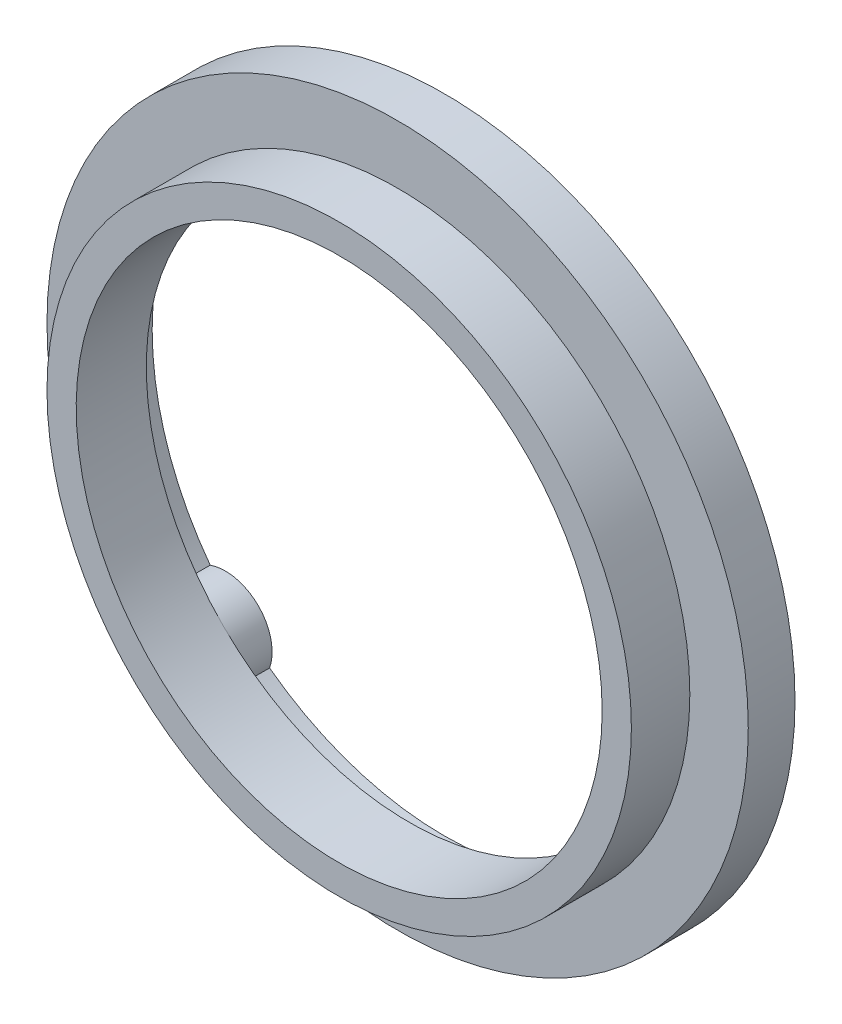
ISO-10303-21;
HEADER;
FILE_DESCRIPTION(('STEP AP214'),'2;1');
FILE_NAME('part.step','',(''),(''),'','','');
FILE_SCHEMA(('AUTOMOTIVE_DESIGN { 1 0 10303 214 1 1 1 1 }'));
ENDSEC;
DATA;
#1=APPLICATION_CONTEXT('core data for automotive mechanical design processes');
#2=APPLICATION_PROTOCOL_DEFINITION('international standard','automotive_design',2000,#1);
#3=PRODUCT_CONTEXT('',#1,'mechanical');
#4=PRODUCT('Part','Part','',(#3));
#5=PRODUCT_RELATED_PRODUCT_CATEGORY('part','',(#4));
#6=PRODUCT_DEFINITION_FORMATION('','',#4);
#7=PRODUCT_DEFINITION_CONTEXT('part definition',#1,'design');
#8=PRODUCT_DEFINITION('design','',#6,#7);
#9=PRODUCT_DEFINITION_SHAPE('','',#8);
#10=(LENGTH_UNIT() NAMED_UNIT(*) SI_UNIT(.MILLI.,.METRE.));
#11=(NAMED_UNIT(*) PLANE_ANGLE_UNIT() SI_UNIT($,.RADIAN.));
#12=(NAMED_UNIT(*) SI_UNIT($,.STERADIAN.) SOLID_ANGLE_UNIT());
#13=UNCERTAINTY_MEASURE_WITH_UNIT(LENGTH_MEASURE(1.E-05),#10,'distance_accuracy_value','');
#14=(GEOMETRIC_REPRESENTATION_CONTEXT(3) GLOBAL_UNCERTAINTY_ASSIGNED_CONTEXT((#13)) GLOBAL_UNIT_ASSIGNED_CONTEXT((#10,
#11,#12)) REPRESENTATION_CONTEXT('',''));
#15=CARTESIAN_POINT('',(0.,0.,0.));
#16=DIRECTION('',(0.,0.,1.));
#17=DIRECTION('',(1.,0.,0.));
#18=AXIS2_PLACEMENT_3D('',#15,#16,#17);
#19=CARTESIAN_POINT('',(-86.6066497970745,-63.7835303855215,4.));
#20=DIRECTION('',(0.,0.,1.));
#21=DIRECTION('',(1.,0.,0.));
#22=AXIS2_PLACEMENT_3D('',#19,#20,#21);
#23=PLANE('',#22);
#24=CARTESIAN_POINT('',(-86.6066497970745,-63.7835303855215,4.));
#25=DIRECTION('',(0.,0.,1.));
#26=DIRECTION('',(1.,0.,0.));
#27=AXIS2_PLACEMENT_3D('',#24,#25,#26);
#28=CIRCLE('',#27,30.);
#29=CARTESIAN_POINT('',(-56.6066497970745,-63.7835303855215,4.));
#30=VERTEX_POINT('',#29);
#31=EDGE_CURVE('E149',#30,#30,#28,.T.);
#32=ORIENTED_EDGE('',*,*,#31,.T.);
#33=EDGE_LOOP('',(#32));
#34=FACE_BOUND('',#33,.T.);
#35=CARTESIAN_POINT('',(-86.6066497970745,-63.7835303855215,4.));
#36=DIRECTION('',(0.,0.,1.));
#37=DIRECTION('',(1.,0.,0.));
#38=AXIS2_PLACEMENT_3D('',#35,#36,#37);
#39=CIRCLE('',#38,25.0000000000019);
#40=CARTESIAN_POINT('',(-61.6066497970727,-63.7835303855215,4.));
#41=VERTEX_POINT('',#40);
#42=EDGE_CURVE('E211',#41,#41,#39,.T.);
#43=ORIENTED_EDGE('',*,*,#42,.F.);
#44=EDGE_LOOP('',(#43));
#45=FACE_BOUND('',#44,.T.);
#46=ADVANCED_FACE('F41',(#34,#45),#23,.T.);
#47=CARTESIAN_POINT('',(-86.6066497970745,-63.7835303855215,0.));
#48=DIRECTION('',(0.,0.,1.));
#49=DIRECTION('',(1.,0.,0.));
#50=AXIS2_PLACEMENT_3D('',#47,#48,#49);
#51=PLANE('',#50);
#52=CARTESIAN_POINT('',(-86.6066497970745,-63.7835303855215,0.));
#53=DIRECTION('',(0.,0.,1.));
#54=DIRECTION('',(1.,0.,0.));
#55=AXIS2_PLACEMENT_3D('',#52,#53,#54);
#56=CIRCLE('',#55,30.);
#57=CARTESIAN_POINT('',(-56.6066497970745,-63.7835303855215,0.));
#58=VERTEX_POINT('',#57);
#59=EDGE_CURVE('E11',#58,#58,#56,.T.);
#60=ORIENTED_EDGE('',*,*,#59,.F.);
#61=EDGE_LOOP('',(#60));
#62=FACE_BOUND('',#61,.T.);
#63=CARTESIAN_POINT('',(-86.6066497970745,-63.7835303855215,0.));
#64=DIRECTION('',(0.,0.,1.));
#65=DIRECTION('',(1.,0.,0.));
#66=AXIS2_PLACEMENT_3D('',#63,#64,#65);
#67=CIRCLE('',#66,25.);
#68=CARTESIAN_POINT('',(-106.64098914591,-48.8294257030042,0.));
#69=VERTEX_POINT('',#68);
#70=CARTESIAN_POINT('',(-106.64098914591,-78.7376350680388,0.));
#71=VERTEX_POINT('',#70);
#72=EDGE_CURVE('E56',#69,#71,#67,.T.);
#73=ORIENTED_EDGE('',*,*,#72,.T.);
#74=CARTESIAN_POINT('',(-105.344979498517,-82.5218600869651,0.));
#75=DIRECTION('',(0.,0.,-1.));
#76=DIRECTION('',(1.,0.,0.));
#77=AXIS2_PLACEMENT_3D('',#74,#75,#76);
#78=CIRCLE('',#77,4.00000000000055);
#79=CARTESIAN_POINT('',(-101.560754479591,-83.8178697343583,0.));
#80=VERTEX_POINT('',#79);
#81=EDGE_CURVE('E148',#71,#80,#78,.T.);
#82=ORIENTED_EDGE('',*,*,#81,.T.);
#83=CARTESIAN_POINT('',(-86.6066497970745,-63.7835303855215,0.));
#84=DIRECTION('',(0.,0.,1.));
#85=DIRECTION('',(1.,0.,0.));
#86=AXIS2_PLACEMENT_3D('',#83,#84,#85);
#87=CIRCLE('',#86,25.);
#88=CARTESIAN_POINT('',(-71.6525451145571,-83.8178697343573,0.));
#89=VERTEX_POINT('',#88);
#90=EDGE_CURVE('E151',#80,#89,#87,.T.);
#91=ORIENTED_EDGE('',*,*,#90,.T.);
#92=CARTESIAN_POINT('',(-67.8683200956299,-82.5218600869638,0.));
#93=DIRECTION('',(0.,0.,-1.));
#94=DIRECTION('',(1.,0.,0.));
#95=AXIS2_PLACEMENT_3D('',#92,#93,#94);
#96=CIRCLE('',#95,4.00000000000147);
#97=CARTESIAN_POINT('',(-66.5723104482369,-78.7376350680364,0.));
#98=VERTEX_POINT('',#97);
#99=EDGE_CURVE('E123',#89,#98,#96,.T.);
#100=ORIENTED_EDGE('',*,*,#99,.T.);
#101=CARTESIAN_POINT('',(-86.6066497970745,-63.7835303855215,0.));
#102=DIRECTION('',(0.,0.,1.));
#103=DIRECTION('',(1.,0.,0.));
#104=AXIS2_PLACEMENT_3D('',#101,#102,#103);
#105=CIRCLE('',#104,25.);
#106=CARTESIAN_POINT('',(-66.5723104482388,-48.829425703004,0.));
#107=VERTEX_POINT('',#106);
#108=EDGE_CURVE('E121',#98,#107,#105,.T.);
#109=ORIENTED_EDGE('',*,*,#108,.T.);
#110=CARTESIAN_POINT('',(-67.8683200956311,-45.0452006840768,0.));
#111=DIRECTION('',(0.,0.,-1.));
#112=DIRECTION('',(1.,0.,0.));
#113=AXIS2_PLACEMENT_3D('',#110,#111,#112);
#114=CIRCLE('',#113,4.00000000000109);
#115=CARTESIAN_POINT('',(-71.6525451145585,-43.7491910366847,0.));
#116=VERTEX_POINT('',#115);
#117=EDGE_CURVE('E98',#107,#116,#114,.T.);
#118=ORIENTED_EDGE('',*,*,#117,.T.);
#119=CARTESIAN_POINT('',(-86.6066497970745,-63.7835303855215,0.));
#120=DIRECTION('',(0.,0.,1.));
#121=DIRECTION('',(1.,0.,0.));
#122=AXIS2_PLACEMENT_3D('',#119,#120,#121);
#123=CIRCLE('',#122,25.);
#124=CARTESIAN_POINT('',(-101.560754479592,-43.7491910366858,0.));
#125=VERTEX_POINT('',#124);
#126=EDGE_CURVE('E110',#116,#125,#123,.T.);
#127=ORIENTED_EDGE('',*,*,#126,.T.);
#128=CARTESIAN_POINT('',(-105.344979498518,-45.0452006840781,0.));
#129=DIRECTION('',(0.,0.,-1.));
#130=DIRECTION('',(1.,0.,0.));
#131=AXIS2_PLACEMENT_3D('',#128,#129,#130);
#132=CIRCLE('',#131,4.);
#133=EDGE_CURVE('E116',#125,#69,#132,.T.);
#134=ORIENTED_EDGE('',*,*,#133,.T.);
#135=EDGE_LOOP('',(#73,#82,#91,#100,#109,#118,#127,#134));
#136=FACE_BOUND('',#135,.T.);
#137=ADVANCED_FACE('F118',(#62,#136),#51,.F.);
#138=CARTESIAN_POINT('',(-86.6066497970745,-63.7835303855215,3.));
#139=DIRECTION('',(0.,0.,-1.));
#140=DIRECTION('',(-1.,0.,0.));
#141=AXIS2_PLACEMENT_3D('',#138,#139,#140);
#142=CYLINDRICAL_SURFACE('',#141,30.);
#143=ORIENTED_EDGE('',*,*,#59,.T.);
#144=EDGE_LOOP('',(#143));
#145=FACE_BOUND('',#144,.T.);
#146=ORIENTED_EDGE('',*,*,#31,.F.);
#147=EDGE_LOOP('',(#146));
#148=FACE_BOUND('',#147,.T.);
#149=ADVANCED_FACE('F43',(#145,#148),#142,.T.);
#150=CARTESIAN_POINT('',(-86.6066497970745,-63.7835303855215,3.));
#151=DIRECTION('',(0.,0.,-1.));
#152=DIRECTION('',(-1.,0.,0.));
#153=AXIS2_PLACEMENT_3D('',#150,#151,#152);
#154=CYLINDRICAL_SURFACE('',#153,25.);
#155=ORIENTED_EDGE('',*,*,#72,.F.);
#156=DIRECTION('',(0.,0.,-1.));
#157=VECTOR('',#156,1.);
#158=CARTESIAN_POINT('',(-106.64098914591,-48.8294257030042,3.));
#159=LINE('',#158,#157);
#160=CARTESIAN_POINT('',(-106.64098914591,-48.8294257030042,3.));
#161=VERTEX_POINT('',#160);
#162=EDGE_CURVE('E129',#161,#69,#159,.T.);
#163=ORIENTED_EDGE('',*,*,#162,.F.);
#164=CARTESIAN_POINT('',(-86.6066497970745,-63.7835303855215,3.));
#165=DIRECTION('',(0.,0.,1.));
#166=DIRECTION('',(1.,0.,0.));
#167=AXIS2_PLACEMENT_3D('',#164,#165,#166);
#168=CIRCLE('',#167,25.);
#169=CARTESIAN_POINT('',(-106.64098914591,-78.7376350680388,3.));
#170=VERTEX_POINT('',#169);
#171=EDGE_CURVE('E128',#161,#170,#168,.T.);
#172=ORIENTED_EDGE('',*,*,#171,.T.);
#173=DIRECTION('',(0.,0.,-1.));
#174=VECTOR('',#173,1.);
#175=CARTESIAN_POINT('',(-106.64098914591,-78.7376350680388,3.));
#176=LINE('',#175,#174);
#177=EDGE_CURVE('E49',#170,#71,#176,.T.);
#178=ORIENTED_EDGE('',*,*,#177,.T.);
#179=EDGE_LOOP('',(#155,#163,#172,#178));
#180=FACE_BOUND('',#179,.T.);
#181=ADVANCED_FACE('F141',(#180),#154,.F.);
#182=CARTESIAN_POINT('',(-105.344979498517,-82.5218600869651,3.));
#183=DIRECTION('',(0.,0.,-1.));
#184=DIRECTION('',(-1.,0.,0.));
#185=AXIS2_PLACEMENT_3D('',#182,#183,#184);
#186=CYLINDRICAL_SURFACE('',#185,4.00000000000055);
#187=ORIENTED_EDGE('',*,*,#81,.F.);
#188=ORIENTED_EDGE('',*,*,#177,.F.);
#189=CARTESIAN_POINT('',(-105.344979498517,-82.5218600869651,3.));
#190=DIRECTION('',(0.,0.,-1.));
#191=DIRECTION('',(1.,0.,0.));
#192=AXIS2_PLACEMENT_3D('',#189,#190,#191);
#193=CIRCLE('',#192,4.00000000000055);
#194=CARTESIAN_POINT('',(-102.516552373771,-79.6934329622191,3.));
#195=VERTEX_POINT('',#194);
#196=EDGE_CURVE('E204',#170,#195,#193,.T.);
#197=ORIENTED_EDGE('',*,*,#196,.T.);
#198=CARTESIAN_POINT('',(-101.560754479591,-83.8178697343583,3.));
#199=VERTEX_POINT('',#198);
#200=EDGE_CURVE('E206',#195,#199,#193,.T.);
#201=ORIENTED_EDGE('',*,*,#200,.T.);
#202=DIRECTION('',(0.,0.,-1.));
#203=VECTOR('',#202,1.);
#204=CARTESIAN_POINT('',(-101.560754479591,-83.8178697343583,3.));
#205=LINE('',#204,#203);
#206=EDGE_CURVE('E138',#199,#80,#205,.T.);
#207=ORIENTED_EDGE('',*,*,#206,.T.);
#208=EDGE_LOOP('',(#187,#188,#197,#201,#207));
#209=FACE_BOUND('',#208,.T.);
#210=ADVANCED_FACE('F263',(#209),#186,.T.);
#211=CARTESIAN_POINT('',(-86.6066497970745,-63.7835303855215,3.));
#212=DIRECTION('',(0.,0.,-1.));
#213=DIRECTION('',(-1.,0.,0.));
#214=AXIS2_PLACEMENT_3D('',#211,#212,#213);
#215=CYLINDRICAL_SURFACE('',#214,25.);
#216=ORIENTED_EDGE('',*,*,#90,.F.);
#217=ORIENTED_EDGE('',*,*,#206,.F.);
#218=CARTESIAN_POINT('',(-86.6066497970745,-63.7835303855215,3.));
#219=DIRECTION('',(0.,0.,1.));
#220=DIRECTION('',(1.,0.,0.));
#221=AXIS2_PLACEMENT_3D('',#218,#219,#220);
#222=CIRCLE('',#221,25.);
#223=CARTESIAN_POINT('',(-71.6525451145571,-83.8178697343573,3.));
#224=VERTEX_POINT('',#223);
#225=EDGE_CURVE('E202',#199,#224,#222,.T.);
#226=ORIENTED_EDGE('',*,*,#225,.T.);
#227=DIRECTION('',(0.,0.,-1.));
#228=VECTOR('',#227,1.);
#229=CARTESIAN_POINT('',(-71.6525451145571,-83.8178697343573,3.));
#230=LINE('',#229,#228);
#231=EDGE_CURVE('E136',#224,#89,#230,.T.);
#232=ORIENTED_EDGE('',*,*,#231,.T.);
#233=EDGE_LOOP('',(#216,#217,#226,#232));
#234=FACE_BOUND('',#233,.T.);
#235=ADVANCED_FACE('F260',(#234),#215,.F.);
#236=CARTESIAN_POINT('',(-67.8683200956299,-82.5218600869638,3.));
#237=DIRECTION('',(0.,0.,-1.));
#238=DIRECTION('',(-1.,0.,0.));
#239=AXIS2_PLACEMENT_3D('',#236,#237,#238);
#240=CYLINDRICAL_SURFACE('',#239,4.00000000000147);
#241=ORIENTED_EDGE('',*,*,#99,.F.);
#242=ORIENTED_EDGE('',*,*,#231,.F.);
#243=CARTESIAN_POINT('',(-67.8683200956299,-82.5218600869638,3.));
#244=DIRECTION('',(0.,0.,-1.));
#245=DIRECTION('',(1.,0.,0.));
#246=AXIS2_PLACEMENT_3D('',#243,#244,#245);
#247=CIRCLE('',#246,4.00000000000147);
#248=CARTESIAN_POINT('',(-70.6967472203765,-79.6934329622176,3.));
#249=VERTEX_POINT('',#248);
#250=EDGE_CURVE('E65',#224,#249,#247,.T.);
#251=ORIENTED_EDGE('',*,*,#250,.T.);
#252=CARTESIAN_POINT('',(-66.5723104482369,-78.7376350680364,3.));
#253=VERTEX_POINT('',#252);
#254=EDGE_CURVE('E168',#249,#253,#247,.T.);
#255=ORIENTED_EDGE('',*,*,#254,.T.);
#256=DIRECTION('',(0.,0.,-1.));
#257=VECTOR('',#256,1.);
#258=CARTESIAN_POINT('',(-66.5723104482369,-78.7376350680364,3.));
#259=LINE('',#258,#257);
#260=EDGE_CURVE('E134',#253,#98,#259,.T.);
#261=ORIENTED_EDGE('',*,*,#260,.T.);
#262=EDGE_LOOP('',(#241,#242,#251,#255,#261));
#263=FACE_BOUND('',#262,.T.);
#264=ADVANCED_FACE('F163',(#263),#240,.T.);
#265=CARTESIAN_POINT('',(-86.6066497970745,-63.7835303855215,3.));
#266=DIRECTION('',(0.,0.,-1.));
#267=DIRECTION('',(-1.,0.,0.));
#268=AXIS2_PLACEMENT_3D('',#265,#266,#267);
#269=CYLINDRICAL_SURFACE('',#268,25.);
#270=ORIENTED_EDGE('',*,*,#108,.F.);
#271=ORIENTED_EDGE('',*,*,#260,.F.);
#272=CARTESIAN_POINT('',(-86.6066497970745,-63.7835303855215,3.));
#273=DIRECTION('',(0.,0.,1.));
#274=DIRECTION('',(1.,0.,0.));
#275=AXIS2_PLACEMENT_3D('',#272,#273,#274);
#276=CIRCLE('',#275,25.);
#277=CARTESIAN_POINT('',(-66.5723104482388,-48.829425703004,3.));
#278=VERTEX_POINT('',#277);
#279=EDGE_CURVE('E174',#253,#278,#276,.T.);
#280=ORIENTED_EDGE('',*,*,#279,.T.);
#281=DIRECTION('',(0.,0.,-1.));
#282=VECTOR('',#281,1.);
#283=CARTESIAN_POINT('',(-66.5723104482388,-48.829425703004,3.));
#284=LINE('',#283,#282);
#285=EDGE_CURVE('E106',#278,#107,#284,.T.);
#286=ORIENTED_EDGE('',*,*,#285,.T.);
#287=EDGE_LOOP('',(#270,#271,#280,#286));
#288=FACE_BOUND('',#287,.T.);
#289=ADVANCED_FACE('F171',(#288),#269,.F.);
#290=CARTESIAN_POINT('',(-67.8683200956311,-45.0452006840768,3.));
#291=DIRECTION('',(0.,0.,-1.));
#292=DIRECTION('',(-1.,0.,0.));
#293=AXIS2_PLACEMENT_3D('',#290,#291,#292);
#294=CYLINDRICAL_SURFACE('',#293,4.00000000000109);
#295=ORIENTED_EDGE('',*,*,#117,.F.);
#296=ORIENTED_EDGE('',*,*,#285,.F.);
#297=CARTESIAN_POINT('',(-67.8683200956311,-45.0452006840768,3.));
#298=DIRECTION('',(0.,0.,-1.));
#299=DIRECTION('',(1.,0.,0.));
#300=AXIS2_PLACEMENT_3D('',#297,#298,#299);
#301=CIRCLE('',#300,4.00000000000109);
#302=CARTESIAN_POINT('',(-70.696747220378,-47.8736278088239,3.));
#303=VERTEX_POINT('',#302);
#304=EDGE_CURVE('E177',#278,#303,#301,.T.);
#305=ORIENTED_EDGE('',*,*,#304,.T.);
#306=CARTESIAN_POINT('',(-71.6525451145585,-43.7491910366847,3.));
#307=VERTEX_POINT('',#306);
#308=EDGE_CURVE('E103',#303,#307,#301,.T.);
#309=ORIENTED_EDGE('',*,*,#308,.T.);
#310=DIRECTION('',(0.,0.,-1.));
#311=VECTOR('',#310,1.);
#312=CARTESIAN_POINT('',(-71.6525451145585,-43.7491910366847,3.));
#313=LINE('',#312,#311);
#314=EDGE_CURVE('E93',#307,#116,#313,.T.);
#315=ORIENTED_EDGE('',*,*,#314,.T.);
#316=EDGE_LOOP('',(#295,#296,#305,#309,#315));
#317=FACE_BOUND('',#316,.T.);
#318=ADVANCED_FACE('F95',(#317),#294,.T.);
#319=CARTESIAN_POINT('',(-86.6066497970745,-63.7835303855215,3.));
#320=DIRECTION('',(0.,0.,-1.));
#321=DIRECTION('',(-1.,0.,0.));
#322=AXIS2_PLACEMENT_3D('',#319,#320,#321);
#323=CYLINDRICAL_SURFACE('',#322,25.);
#324=ORIENTED_EDGE('',*,*,#126,.F.);
#325=ORIENTED_EDGE('',*,*,#314,.F.);
#326=CARTESIAN_POINT('',(-86.6066497970745,-63.7835303855215,3.));
#327=DIRECTION('',(0.,0.,1.));
#328=DIRECTION('',(1.,0.,0.));
#329=AXIS2_PLACEMENT_3D('',#326,#327,#328);
#330=CIRCLE('',#329,25.);
#331=CARTESIAN_POINT('',(-101.560754479592,-43.7491910366858,3.));
#332=VERTEX_POINT('',#331);
#333=EDGE_CURVE('E188',#307,#332,#330,.T.);
#334=ORIENTED_EDGE('',*,*,#333,.T.);
#335=DIRECTION('',(0.,0.,-1.));
#336=VECTOR('',#335,1.);
#337=CARTESIAN_POINT('',(-101.560754479592,-43.7491910366858,3.));
#338=LINE('',#337,#336);
#339=EDGE_CURVE('E107',#332,#125,#338,.T.);
#340=ORIENTED_EDGE('',*,*,#339,.T.);
#341=EDGE_LOOP('',(#324,#325,#334,#340));
#342=FACE_BOUND('',#341,.T.);
#343=ADVANCED_FACE('F111',(#342),#323,.F.);
#344=CARTESIAN_POINT('',(-105.344979498518,-45.0452006840781,3.));
#345=DIRECTION('',(0.,0.,-1.));
#346=DIRECTION('',(-1.,0.,0.));
#347=AXIS2_PLACEMENT_3D('',#344,#345,#346);
#348=CYLINDRICAL_SURFACE('',#347,4.);
#349=ORIENTED_EDGE('',*,*,#133,.F.);
#350=ORIENTED_EDGE('',*,*,#339,.F.);
#351=CARTESIAN_POINT('',(-105.344979498518,-45.0452006840781,3.));
#352=DIRECTION('',(0.,0.,-1.));
#353=DIRECTION('',(1.,0.,0.));
#354=AXIS2_PLACEMENT_3D('',#351,#352,#353);
#355=CIRCLE('',#354,4.);
#356=CARTESIAN_POINT('',(-102.516552373772,-47.8736278088245,3.));
#357=VERTEX_POINT('',#356);
#358=EDGE_CURVE('E131',#332,#357,#355,.T.);
#359=ORIENTED_EDGE('',*,*,#358,.T.);
#360=EDGE_CURVE('E196',#357,#161,#355,.T.);
#361=ORIENTED_EDGE('',*,*,#360,.T.);
#362=ORIENTED_EDGE('',*,*,#162,.T.);
#363=EDGE_LOOP('',(#349,#350,#359,#361,#362));
#364=FACE_BOUND('',#363,.T.);
#365=ADVANCED_FACE('F197',(#364),#348,.T.);
#366=CARTESIAN_POINT('',(-86.6066497970745,-63.7835303855215,3.));
#367=DIRECTION('',(0.,0.,1.));
#368=DIRECTION('',(1.,0.,0.));
#369=AXIS2_PLACEMENT_3D('',#366,#367,#368);
#370=PLANE('',#369);
#371=ORIENTED_EDGE('',*,*,#358,.F.);
#372=ORIENTED_EDGE('',*,*,#333,.F.);
#373=ORIENTED_EDGE('',*,*,#308,.F.);
#374=CARTESIAN_POINT('',(-86.6066497970745,-63.7835303855215,3.));
#375=DIRECTION('',(0.,0.,1.));
#376=DIRECTION('',(1.,0.,0.));
#377=AXIS2_PLACEMENT_3D('',#374,#375,#376);
#378=CIRCLE('',#377,22.4999999999996);
#379=EDGE_CURVE('E154',#303,#357,#378,.T.);
#380=ORIENTED_EDGE('',*,*,#379,.T.);
#381=EDGE_LOOP('',(#371,#372,#373,#380));
#382=FACE_BOUND('',#381,.T.);
#383=ADVANCED_FACE('F191',(#382),#370,.F.);
#384=ORIENTED_EDGE('',*,*,#360,.F.);
#385=EDGE_CURVE('E209',#357,#195,#378,.T.);
#386=ORIENTED_EDGE('',*,*,#385,.T.);
#387=ORIENTED_EDGE('',*,*,#196,.F.);
#388=ORIENTED_EDGE('',*,*,#171,.F.);
#389=EDGE_LOOP('',(#384,#386,#387,#388));
#390=FACE_BOUND('',#389,.T.);
#391=ADVANCED_FACE('F249',(#390),#370,.F.);
#392=ORIENTED_EDGE('',*,*,#304,.F.);
#393=ORIENTED_EDGE('',*,*,#279,.F.);
#394=ORIENTED_EDGE('',*,*,#254,.F.);
#395=EDGE_CURVE('E210',#249,#303,#378,.T.);
#396=ORIENTED_EDGE('',*,*,#395,.T.);
#397=EDGE_LOOP('',(#392,#393,#394,#396));
#398=FACE_BOUND('',#397,.T.);
#399=ADVANCED_FACE('F354',(#398),#370,.F.);
#400=ORIENTED_EDGE('',*,*,#200,.F.);
#401=EDGE_CURVE('E401',#195,#249,#378,.T.);
#402=ORIENTED_EDGE('',*,*,#401,.T.);
#403=ORIENTED_EDGE('',*,*,#250,.F.);
#404=ORIENTED_EDGE('',*,*,#225,.F.);
#405=EDGE_LOOP('',(#400,#402,#403,#404));
#406=FACE_BOUND('',#405,.T.);
#407=ADVANCED_FACE('F234',(#406),#370,.F.);
#408=CARTESIAN_POINT('',(-86.6066497970745,-63.7835303855215,4.));
#409=DIRECTION('',(0.,0.,-1.));
#410=DIRECTION('',(-1.,0.,0.));
#411=AXIS2_PLACEMENT_3D('',#408,#409,#410);
#412=CYLINDRICAL_SURFACE('',#411,22.4999999999996);
#413=ORIENTED_EDGE('',*,*,#379,.F.);
#414=ORIENTED_EDGE('',*,*,#395,.F.);
#415=ORIENTED_EDGE('',*,*,#401,.F.);
#416=ORIENTED_EDGE('',*,*,#385,.F.);
#417=EDGE_LOOP('',(#413,#414,#415,#416));
#418=FACE_BOUND('',#417,.T.);
#419=CARTESIAN_POINT('',(-86.6066497970745,-63.7835303855215,9.));
#420=DIRECTION('',(0.,0.,1.));
#421=DIRECTION('',(1.,0.,0.));
#422=AXIS2_PLACEMENT_3D('',#419,#420,#421);
#423=CIRCLE('',#422,22.4999999999996);
#424=CARTESIAN_POINT('',(-64.1066497970749,-63.7835303855215,9.));
#425=VERTEX_POINT('',#424);
#426=EDGE_CURVE('E215',#425,#425,#423,.T.);
#427=ORIENTED_EDGE('',*,*,#426,.T.);
#428=EDGE_LOOP('',(#427));
#429=FACE_BOUND('',#428,.T.);
#430=ADVANCED_FACE('F221',(#418,#429),#412,.F.);
#431=CARTESIAN_POINT('',(-86.6066497970745,-63.7835303855215,9.));
#432=DIRECTION('',(0.,0.,1.));
#433=DIRECTION('',(1.,0.,0.));
#434=AXIS2_PLACEMENT_3D('',#431,#432,#433);
#435=PLANE('',#434);
#436=CARTESIAN_POINT('',(-86.6066497970745,-63.7835303855215,9.));
#437=DIRECTION('',(0.,0.,1.));
#438=DIRECTION('',(1.,0.,0.));
#439=AXIS2_PLACEMENT_3D('',#436,#437,#438);
#440=CIRCLE('',#439,25.0000000000019);
#441=CARTESIAN_POINT('',(-61.6066497970727,-63.7835303855215,9.));
#442=VERTEX_POINT('',#441);
#443=EDGE_CURVE('E214',#442,#442,#440,.T.);
#444=ORIENTED_EDGE('',*,*,#443,.T.);
#445=EDGE_LOOP('',(#444));
#446=FACE_BOUND('',#445,.T.);
#447=ORIENTED_EDGE('',*,*,#426,.F.);
#448=EDGE_LOOP('',(#447));
#449=FACE_BOUND('',#448,.T.);
#450=ADVANCED_FACE('F223',(#446,#449),#435,.T.);
#451=CARTESIAN_POINT('',(-86.6066497970745,-63.7835303855215,9.));
#452=DIRECTION('',(0.,0.,-1.));
#453=DIRECTION('',(-1.,0.,0.));
#454=AXIS2_PLACEMENT_3D('',#451,#452,#453);
#455=CYLINDRICAL_SURFACE('',#454,25.0000000000019);
#456=ORIENTED_EDGE('',*,*,#443,.F.);
#457=EDGE_LOOP('',(#456));
#458=FACE_BOUND('',#457,.T.);
#459=ORIENTED_EDGE('',*,*,#42,.T.);
#460=EDGE_LOOP('',(#459));
#461=FACE_BOUND('',#460,.T.);
#462=ADVANCED_FACE('F225',(#458,#461),#455,.T.);
#463=CLOSED_SHELL('',(#46,#137,#149,#181,#210,#235,#264,#289,#318,#343,#365,#383,#391,#399,#407,
#430,#450,#462));
#464=MANIFOLD_SOLID_BREP('B2',#463);
#465=ADVANCED_BREP_SHAPE_REPRESENTATION('',(#18,#464),#14);
#466=SHAPE_DEFINITION_REPRESENTATION(#9,#465);
ENDSEC;
END-ISO-10303-21;
